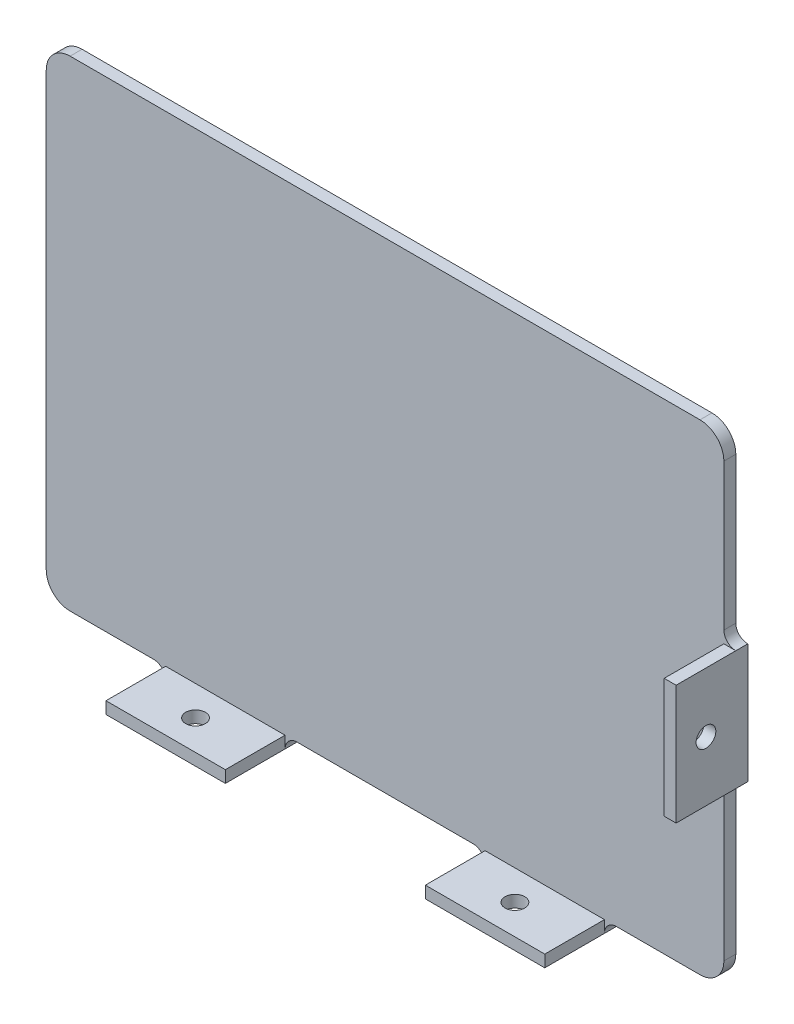
ISO-10303-21;
HEADER;
FILE_DESCRIPTION(('STEP AP214'),'2;1');
FILE_NAME('part.step','',(''),(''),'','','');
FILE_SCHEMA(('AUTOMOTIVE_DESIGN { 1 0 10303 214 1 1 1 1 }'));
ENDSEC;
DATA;
#1=APPLICATION_CONTEXT('core data for automotive mechanical design processes');
#2=APPLICATION_PROTOCOL_DEFINITION('international standard','automotive_design',2000,#1);
#3=PRODUCT_CONTEXT('',#1,'mechanical');
#4=PRODUCT('Part','Part','',(#3));
#5=PRODUCT_RELATED_PRODUCT_CATEGORY('part','',(#4));
#6=PRODUCT_DEFINITION_FORMATION('','',#4);
#7=PRODUCT_DEFINITION_CONTEXT('part definition',#1,'design');
#8=PRODUCT_DEFINITION('design','',#6,#7);
#9=PRODUCT_DEFINITION_SHAPE('','',#8);
#10=(LENGTH_UNIT() NAMED_UNIT(*) SI_UNIT(.MILLI.,.METRE.));
#11=(NAMED_UNIT(*) PLANE_ANGLE_UNIT() SI_UNIT($,.RADIAN.));
#12=(NAMED_UNIT(*) SI_UNIT($,.STERADIAN.) SOLID_ANGLE_UNIT());
#13=UNCERTAINTY_MEASURE_WITH_UNIT(LENGTH_MEASURE(1.E-05),#10,'distance_accuracy_value','');
#14=(GEOMETRIC_REPRESENTATION_CONTEXT(3) GLOBAL_UNCERTAINTY_ASSIGNED_CONTEXT((#13)) GLOBAL_UNIT_ASSIGNED_CONTEXT((#10,
#11,#12)) REPRESENTATION_CONTEXT('',''));
#15=CARTESIAN_POINT('',(0.,0.,0.));
#16=DIRECTION('',(0.,0.,1.));
#17=DIRECTION('',(1.,0.,0.));
#18=AXIS2_PLACEMENT_3D('',#15,#16,#17);
#19=CARTESIAN_POINT('',(4.00000000000003,0.,2.));
#20=DIRECTION('',(0.,1.,0.));
#21=DIRECTION('',(0.,0.,1.));
#22=AXIS2_PLACEMENT_3D('',#19,#20,#21);
#23=PLANE('',#22);
#24=DIRECTION('',(1.,0.,0.));
#25=VECTOR('',#24,1.);
#26=CARTESIAN_POINT('',(4.00000000000003,0.,2.));
#27=LINE('',#26,#25);
#28=CARTESIAN_POINT('',(42.,0.,2.));
#29=VERTEX_POINT('',#28);
#30=CARTESIAN_POINT('',(71.5,0.,2.));
#31=VERTEX_POINT('',#30);
#32=EDGE_CURVE('E378',#29,#31,#27,.T.);
#33=ORIENTED_EDGE('',*,*,#32,.F.);
#34=DIRECTION('',(0.,0.,1.));
#35=VECTOR('',#34,1.);
#36=CARTESIAN_POINT('',(42.,0.,2.));
#37=LINE('',#36,#35);
#38=CARTESIAN_POINT('',(42.,0.,0.));
#39=VERTEX_POINT('',#38);
#40=EDGE_CURVE('E479',#29,#39,#37,.F.);
#41=ORIENTED_EDGE('',*,*,#40,.T.);
#42=DIRECTION('',(1.,0.,0.));
#43=VECTOR('',#42,1.);
#44=CARTESIAN_POINT('',(4.00000000000003,0.,0.));
#45=LINE('',#44,#43);
#46=CARTESIAN_POINT('',(71.5,0.,0.));
#47=VERTEX_POINT('',#46);
#48=EDGE_CURVE('E408',#39,#47,#45,.T.);
#49=ORIENTED_EDGE('',*,*,#48,.T.);
#50=DIRECTION('',(0.,0.,1.));
#51=VECTOR('',#50,1.);
#52=CARTESIAN_POINT('',(71.5,0.,2.));
#53=LINE('',#52,#51);
#54=EDGE_CURVE('E475',#47,#31,#53,.T.);
#55=ORIENTED_EDGE('',*,*,#54,.T.);
#56=EDGE_LOOP('',(#33,#41,#49,#55));
#57=FACE_BOUND('',#56,.T.);
#58=ADVANCED_FACE('F39',(#57),#23,.F.);
#59=CARTESIAN_POINT('',(4.00000000000003,0.,0.));
#60=VERTEX_POINT('',#59);
#61=CARTESIAN_POINT('',(18.,0.,0.));
#62=VERTEX_POINT('',#61);
#63=EDGE_CURVE('E403',#60,#62,#45,.T.);
#64=ORIENTED_EDGE('',*,*,#63,.T.);
#65=DIRECTION('',(0.,0.,1.));
#66=VECTOR('',#65,1.);
#67=CARTESIAN_POINT('',(18.,0.,2.));
#68=LINE('',#67,#66);
#69=CARTESIAN_POINT('',(18.,0.,2.));
#70=VERTEX_POINT('',#69);
#71=EDGE_CURVE('E482',#62,#70,#68,.T.);
#72=ORIENTED_EDGE('',*,*,#71,.T.);
#73=CARTESIAN_POINT('',(4.00000000000003,0.,2.));
#74=VERTEX_POINT('',#73);
#75=EDGE_CURVE('E373',#74,#70,#27,.T.);
#76=ORIENTED_EDGE('',*,*,#75,.F.);
#77=DIRECTION('',(0.,0.,-1.));
#78=VECTOR('',#77,1.);
#79=CARTESIAN_POINT('',(4.00000000000003,0.,2.));
#80=LINE('',#79,#78);
#81=EDGE_CURVE('E454',#74,#60,#80,.T.);
#82=ORIENTED_EDGE('',*,*,#81,.T.);
#83=EDGE_LOOP('',(#64,#72,#76,#82));
#84=FACE_BOUND('',#83,.T.);
#85=ADVANCED_FACE('F611',(#84),#23,.F.);
#86=CARTESIAN_POINT('',(113.5,4.,2.));
#87=DIRECTION('',(-1.,0.,0.));
#88=DIRECTION('',(0.,0.,1.));
#89=AXIS2_PLACEMENT_3D('',#86,#87,#88);
#90=PLANE('',#89);
#91=DIRECTION('',(0.,1.,0.));
#92=VECTOR('',#91,1.);
#93=CARTESIAN_POINT('',(113.5,4.,2.));
#94=LINE('',#93,#92);
#95=CARTESIAN_POINT('',(113.5,52.,2.));
#96=VERTEX_POINT('',#95);
#97=CARTESIAN_POINT('',(113.5,76.5,2.));
#98=VERTEX_POINT('',#97);
#99=EDGE_CURVE('E381',#96,#98,#94,.T.);
#100=ORIENTED_EDGE('',*,*,#99,.F.);
#101=DIRECTION('',(0.,0.,1.));
#102=VECTOR('',#101,1.);
#103=CARTESIAN_POINT('',(113.5,52.,2.));
#104=LINE('',#103,#102);
#105=CARTESIAN_POINT('',(113.5,52.,0.));
#106=VERTEX_POINT('',#105);
#107=EDGE_CURVE('E461',#96,#106,#104,.F.);
#108=ORIENTED_EDGE('',*,*,#107,.T.);
#109=DIRECTION('',(0.,1.,0.));
#110=VECTOR('',#109,1.);
#111=CARTESIAN_POINT('',(113.5,4.,0.));
#112=LINE('',#111,#110);
#113=CARTESIAN_POINT('',(113.5,76.5,0.));
#114=VERTEX_POINT('',#113);
#115=EDGE_CURVE('E411',#106,#114,#112,.T.);
#116=ORIENTED_EDGE('',*,*,#115,.T.);
#117=DIRECTION('',(0.,0.,-1.));
#118=VECTOR('',#117,1.);
#119=CARTESIAN_POINT('',(113.5,76.5,2.));
#120=LINE('',#119,#118);
#121=EDGE_CURVE('E442',#98,#114,#120,.T.);
#122=ORIENTED_EDGE('',*,*,#121,.F.);
#123=EDGE_LOOP('',(#100,#108,#116,#122));
#124=FACE_BOUND('',#123,.T.);
#125=ADVANCED_FACE('F641',(#124),#90,.F.);
#126=CARTESIAN_POINT('',(4.,4.,2.));
#127=DIRECTION('',(0.,0.,-1.));
#128=DIRECTION('',(-1.,0.,0.));
#129=AXIS2_PLACEMENT_3D('',#126,#127,#128);
#130=CYLINDRICAL_SURFACE('',#129,4.);
#131=CARTESIAN_POINT('',(4.,4.,0.));
#132=DIRECTION('',(0.,0.,1.));
#133=DIRECTION('',(-1.,0.,0.));
#134=AXIS2_PLACEMENT_3D('',#131,#132,#133);
#135=CIRCLE('',#134,4.);
#136=CARTESIAN_POINT('',(0.,4.00000000000003,0.));
#137=VERTEX_POINT('',#136);
#138=EDGE_CURVE('E366',#137,#60,#135,.T.);
#139=ORIENTED_EDGE('',*,*,#138,.T.);
#140=ORIENTED_EDGE('',*,*,#81,.F.);
#141=CARTESIAN_POINT('',(4.,4.,2.));
#142=DIRECTION('',(0.,0.,1.));
#143=DIRECTION('',(-1.,0.,0.));
#144=AXIS2_PLACEMENT_3D('',#141,#142,#143);
#145=CIRCLE('',#144,4.);
#146=CARTESIAN_POINT('',(0.,4.00000000000003,2.));
#147=VERTEX_POINT('',#146);
#148=EDGE_CURVE('E367',#147,#74,#145,.T.);
#149=ORIENTED_EDGE('',*,*,#148,.F.);
#150=DIRECTION('',(0.,0.,-1.));
#151=VECTOR('',#150,1.);
#152=CARTESIAN_POINT('',(0.,4.00000000000003,2.));
#153=LINE('',#152,#151);
#154=EDGE_CURVE('E398',#147,#137,#153,.T.);
#155=ORIENTED_EDGE('',*,*,#154,.T.);
#156=EDGE_LOOP('',(#139,#140,#149,#155));
#157=FACE_BOUND('',#156,.T.);
#158=ADVANCED_FACE('F617',(#157),#130,.T.);
#159=CARTESIAN_POINT('',(95.5,0.,2.));
#160=VERTEX_POINT('',#159);
#161=CARTESIAN_POINT('',(109.5,0.,2.));
#162=VERTEX_POINT('',#161);
#163=EDGE_CURVE('E371',#160,#162,#27,.T.);
#164=ORIENTED_EDGE('',*,*,#163,.F.);
#165=DIRECTION('',(0.,0.,1.));
#166=VECTOR('',#165,1.);
#167=CARTESIAN_POINT('',(95.5,0.,2.));
#168=LINE('',#167,#166);
#169=CARTESIAN_POINT('',(95.5,0.,0.));
#170=VERTEX_POINT('',#169);
#171=EDGE_CURVE('E493',#160,#170,#168,.F.);
#172=ORIENTED_EDGE('',*,*,#171,.T.);
#173=CARTESIAN_POINT('',(109.5,0.,0.));
#174=VERTEX_POINT('',#173);
#175=EDGE_CURVE('E402',#170,#174,#45,.T.);
#176=ORIENTED_EDGE('',*,*,#175,.T.);
#177=DIRECTION('',(0.,0.,-1.));
#178=VECTOR('',#177,1.);
#179=CARTESIAN_POINT('',(109.5,0.,2.));
#180=LINE('',#179,#178);
#181=EDGE_CURVE('E450',#162,#174,#180,.T.);
#182=ORIENTED_EDGE('',*,*,#181,.F.);
#183=EDGE_LOOP('',(#164,#172,#176,#182));
#184=FACE_BOUND('',#183,.T.);
#185=ADVANCED_FACE('F534',(#184),#23,.F.);
#186=CARTESIAN_POINT('',(109.5,4.,2.));
#187=DIRECTION('',(0.,0.,-1.));
#188=DIRECTION('',(-1.,0.,0.));
#189=AXIS2_PLACEMENT_3D('',#186,#187,#188);
#190=CYLINDRICAL_SURFACE('',#189,4.);
#191=CARTESIAN_POINT('',(109.5,4.,0.));
#192=DIRECTION('',(0.,0.,1.));
#193=DIRECTION('',(1.,0.,0.));
#194=AXIS2_PLACEMENT_3D('',#191,#192,#193);
#195=CIRCLE('',#194,4.);
#196=CARTESIAN_POINT('',(113.5,4.,0.));
#197=VERTEX_POINT('',#196);
#198=EDGE_CURVE('E407',#174,#197,#195,.T.);
#199=ORIENTED_EDGE('',*,*,#198,.T.);
#200=DIRECTION('',(0.,0.,-1.));
#201=VECTOR('',#200,1.);
#202=CARTESIAN_POINT('',(113.5,4.,2.));
#203=LINE('',#202,#201);
#204=CARTESIAN_POINT('',(113.5,4.,2.));
#205=VERTEX_POINT('',#204);
#206=EDGE_CURVE('E446',#205,#197,#203,.T.);
#207=ORIENTED_EDGE('',*,*,#206,.F.);
#208=CARTESIAN_POINT('',(109.5,4.,2.));
#209=DIRECTION('',(0.,0.,1.));
#210=DIRECTION('',(1.,0.,0.));
#211=AXIS2_PLACEMENT_3D('',#208,#209,#210);
#212=CIRCLE('',#211,4.);
#213=EDGE_CURVE('E377',#162,#205,#212,.T.);
#214=ORIENTED_EDGE('',*,*,#213,.F.);
#215=ORIENTED_EDGE('',*,*,#181,.T.);
#216=EDGE_LOOP('',(#199,#207,#214,#215));
#217=FACE_BOUND('',#216,.T.);
#218=ADVANCED_FACE('F558',(#217),#190,.T.);
#219=CARTESIAN_POINT('',(113.5,28.,0.));
#220=VERTEX_POINT('',#219);
#221=EDGE_CURVE('E412',#197,#220,#112,.T.);
#222=ORIENTED_EDGE('',*,*,#221,.T.);
#223=DIRECTION('',(0.,0.,1.));
#224=VECTOR('',#223,1.);
#225=CARTESIAN_POINT('',(113.5,28.,2.));
#226=LINE('',#225,#224);
#227=CARTESIAN_POINT('',(113.5,28.,2.));
#228=VERTEX_POINT('',#227);
#229=EDGE_CURVE('E464',#220,#228,#226,.T.);
#230=ORIENTED_EDGE('',*,*,#229,.T.);
#231=EDGE_CURVE('E382',#205,#228,#94,.T.);
#232=ORIENTED_EDGE('',*,*,#231,.F.);
#233=ORIENTED_EDGE('',*,*,#206,.T.);
#234=EDGE_LOOP('',(#222,#230,#232,#233));
#235=FACE_BOUND('',#234,.T.);
#236=ADVANCED_FACE('F565',(#235),#90,.F.);
#237=CARTESIAN_POINT('',(109.5,76.5,2.));
#238=DIRECTION('',(0.,0.,-1.));
#239=DIRECTION('',(-1.,0.,0.));
#240=AXIS2_PLACEMENT_3D('',#237,#238,#239);
#241=CYLINDRICAL_SURFACE('',#240,4.);
#242=CARTESIAN_POINT('',(109.5,76.5,0.));
#243=DIRECTION('',(0.,0.,1.));
#244=DIRECTION('',(-1.,0.,0.));
#245=AXIS2_PLACEMENT_3D('',#242,#243,#244);
#246=CIRCLE('',#245,4.);
#247=CARTESIAN_POINT('',(109.5,80.5,0.));
#248=VERTEX_POINT('',#247);
#249=EDGE_CURVE('E416',#114,#248,#246,.T.);
#250=ORIENTED_EDGE('',*,*,#249,.T.);
#251=DIRECTION('',(0.,0.,-1.));
#252=VECTOR('',#251,1.);
#253=CARTESIAN_POINT('',(109.5,80.5,2.));
#254=LINE('',#253,#252);
#255=CARTESIAN_POINT('',(109.5,80.5,2.));
#256=VERTEX_POINT('',#255);
#257=EDGE_CURVE('E438',#256,#248,#254,.T.);
#258=ORIENTED_EDGE('',*,*,#257,.F.);
#259=CARTESIAN_POINT('',(109.5,76.5,2.));
#260=DIRECTION('',(0.,0.,1.));
#261=DIRECTION('',(-1.,0.,0.));
#262=AXIS2_PLACEMENT_3D('',#259,#260,#261);
#263=CIRCLE('',#262,4.);
#264=EDGE_CURVE('E386',#98,#256,#263,.T.);
#265=ORIENTED_EDGE('',*,*,#264,.F.);
#266=ORIENTED_EDGE('',*,*,#121,.T.);
#267=EDGE_LOOP('',(#250,#258,#265,#266));
#268=FACE_BOUND('',#267,.T.);
#269=ADVANCED_FACE('F636',(#268),#241,.T.);
#270=CARTESIAN_POINT('',(4.,80.5,2.));
#271=DIRECTION('',(0.,-1.,0.));
#272=DIRECTION('',(0.,0.,-1.));
#273=AXIS2_PLACEMENT_3D('',#270,#271,#272);
#274=PLANE('',#273);
#275=DIRECTION('',(-1.,0.,0.));
#276=VECTOR('',#275,1.);
#277=CARTESIAN_POINT('',(4.,80.5,0.));
#278=LINE('',#277,#276);
#279=CARTESIAN_POINT('',(4.,80.5,0.));
#280=VERTEX_POINT('',#279);
#281=EDGE_CURVE('E419',#248,#280,#278,.T.);
#282=ORIENTED_EDGE('',*,*,#281,.T.);
#283=DIRECTION('',(0.,0.,-1.));
#284=VECTOR('',#283,1.);
#285=CARTESIAN_POINT('',(4.,80.5,2.));
#286=LINE('',#285,#284);
#287=CARTESIAN_POINT('',(4.,80.5,2.));
#288=VERTEX_POINT('',#287);
#289=EDGE_CURVE('E434',#288,#280,#286,.T.);
#290=ORIENTED_EDGE('',*,*,#289,.F.);
#291=DIRECTION('',(-1.,0.,0.));
#292=VECTOR('',#291,1.);
#293=CARTESIAN_POINT('',(4.,80.5,2.));
#294=LINE('',#293,#292);
#295=EDGE_CURVE('E389',#256,#288,#294,.T.);
#296=ORIENTED_EDGE('',*,*,#295,.F.);
#297=ORIENTED_EDGE('',*,*,#257,.T.);
#298=EDGE_LOOP('',(#282,#290,#296,#297));
#299=FACE_BOUND('',#298,.T.);
#300=ADVANCED_FACE('F630',(#299),#274,.F.);
#301=CARTESIAN_POINT('',(4.,76.5,2.));
#302=DIRECTION('',(0.,0.,-1.));
#303=DIRECTION('',(-1.,0.,0.));
#304=AXIS2_PLACEMENT_3D('',#301,#302,#303);
#305=CYLINDRICAL_SURFACE('',#304,4.);
#306=CARTESIAN_POINT('',(4.,76.5,0.));
#307=DIRECTION('',(0.,0.,1.));
#308=DIRECTION('',(-1.,0.,0.));
#309=AXIS2_PLACEMENT_3D('',#306,#307,#308);
#310=CIRCLE('',#309,4.);
#311=CARTESIAN_POINT('',(0.,76.5,0.));
#312=VERTEX_POINT('',#311);
#313=EDGE_CURVE('E422',#280,#312,#310,.T.);
#314=ORIENTED_EDGE('',*,*,#313,.T.);
#315=DIRECTION('',(0.,0.,-1.));
#316=VECTOR('',#315,1.);
#317=CARTESIAN_POINT('',(0.,76.5,2.));
#318=LINE('',#317,#316);
#319=CARTESIAN_POINT('',(0.,76.5,2.));
#320=VERTEX_POINT('',#319);
#321=EDGE_CURVE('E430',#320,#312,#318,.T.);
#322=ORIENTED_EDGE('',*,*,#321,.F.);
#323=CARTESIAN_POINT('',(4.,76.5,2.));
#324=DIRECTION('',(0.,0.,1.));
#325=DIRECTION('',(-1.,0.,0.));
#326=AXIS2_PLACEMENT_3D('',#323,#324,#325);
#327=CIRCLE('',#326,4.);
#328=EDGE_CURVE('E392',#288,#320,#327,.T.);
#329=ORIENTED_EDGE('',*,*,#328,.F.);
#330=ORIENTED_EDGE('',*,*,#289,.T.);
#331=EDGE_LOOP('',(#314,#322,#329,#330));
#332=FACE_BOUND('',#331,.T.);
#333=ADVANCED_FACE('F626',(#332),#305,.T.);
#334=CARTESIAN_POINT('',(0.,4.00000000000003,2.));
#335=DIRECTION('',(1.,0.,0.));
#336=DIRECTION('',(0.,0.,-1.));
#337=AXIS2_PLACEMENT_3D('',#334,#335,#336);
#338=PLANE('',#337);
#339=DIRECTION('',(0.,-1.,0.));
#340=VECTOR('',#339,1.);
#341=CARTESIAN_POINT('',(0.,4.00000000000003,0.));
#342=LINE('',#341,#340);
#343=EDGE_CURVE('E372',#312,#137,#342,.T.);
#344=ORIENTED_EDGE('',*,*,#343,.T.);
#345=ORIENTED_EDGE('',*,*,#154,.F.);
#346=DIRECTION('',(0.,-1.,0.));
#347=VECTOR('',#346,1.);
#348=CARTESIAN_POINT('',(0.,4.00000000000003,2.));
#349=LINE('',#348,#347);
#350=EDGE_CURVE('E395',#320,#147,#349,.T.);
#351=ORIENTED_EDGE('',*,*,#350,.F.);
#352=ORIENTED_EDGE('',*,*,#321,.T.);
#353=EDGE_LOOP('',(#344,#345,#351,#352));
#354=FACE_BOUND('',#353,.T.);
#355=ADVANCED_FACE('F622',(#354),#338,.F.);
#356=CARTESIAN_POINT('',(4.,4.,2.));
#357=DIRECTION('',(0.,0.,-1.));
#358=DIRECTION('',(-1.,0.,0.));
#359=AXIS2_PLACEMENT_3D('',#356,#357,#358);
#360=PLANE('',#359);
#361=ORIENTED_EDGE('',*,*,#148,.T.);
#362=ORIENTED_EDGE('',*,*,#75,.T.);
#363=CARTESIAN_POINT('',(18.,-2.,2.));
#364=DIRECTION('',(0.,0.,-1.));
#365=DIRECTION('',(-1.,0.,0.));
#366=AXIS2_PLACEMENT_3D('',#363,#364,#365);
#367=CIRCLE('',#366,2.);
#368=CARTESIAN_POINT('',(20.,-2.00000000000004,2.));
#369=VERTEX_POINT('',#368);
#370=EDGE_CURVE('E514',#70,#369,#367,.T.);
#371=ORIENTED_EDGE('',*,*,#370,.T.);
#372=DIRECTION('',(0.,-1.,0.));
#373=VECTOR('',#372,1.);
#374=CARTESIAN_POINT('',(20.,0.,2.));
#375=LINE('',#374,#373);
#376=CARTESIAN_POINT('',(20.,0.,2.));
#377=VERTEX_POINT('',#376);
#378=EDGE_CURVE('E62',#377,#369,#375,.T.);
#379=ORIENTED_EDGE('',*,*,#378,.F.);
#380=DIRECTION('',(1.,0.,0.));
#381=VECTOR('',#380,1.);
#382=CARTESIAN_POINT('',(4.,0.,2.));
#383=LINE('',#382,#381);
#384=CARTESIAN_POINT('',(40.,0.,2.));
#385=VERTEX_POINT('',#384);
#386=EDGE_CURVE('E311',#377,#385,#383,.T.);
#387=ORIENTED_EDGE('',*,*,#386,.T.);
#388=DIRECTION('',(0.,1.,0.));
#389=VECTOR('',#388,1.);
#390=CARTESIAN_POINT('',(40.,0.,2.));
#391=LINE('',#390,#389);
#392=CARTESIAN_POINT('',(40.,-2.00000000000003,2.));
#393=VERTEX_POINT('',#392);
#394=EDGE_CURVE('E472',#393,#385,#391,.T.);
#395=ORIENTED_EDGE('',*,*,#394,.F.);
#396=CARTESIAN_POINT('',(42.,-2.,2.));
#397=DIRECTION('',(0.,0.,-1.));
#398=DIRECTION('',(-1.,0.,0.));
#399=AXIS2_PLACEMENT_3D('',#396,#397,#398);
#400=CIRCLE('',#399,2.);
#401=EDGE_CURVE('E508',#393,#29,#400,.T.);
#402=ORIENTED_EDGE('',*,*,#401,.T.);
#403=ORIENTED_EDGE('',*,*,#32,.T.);
#404=CARTESIAN_POINT('',(71.5,-2.,2.));
#405=DIRECTION('',(0.,0.,-1.));
#406=DIRECTION('',(-1.,0.,0.));
#407=AXIS2_PLACEMENT_3D('',#404,#405,#406);
#408=CIRCLE('',#407,2.);
#409=CARTESIAN_POINT('',(73.5,-2.00000000000001,2.));
#410=VERTEX_POINT('',#409);
#411=EDGE_CURVE('E520',#31,#410,#408,.T.);
#412=ORIENTED_EDGE('',*,*,#411,.T.);
#413=DIRECTION('',(0.,-1.,0.));
#414=VECTOR('',#413,1.);
#415=CARTESIAN_POINT('',(73.5,0.,2.));
#416=LINE('',#415,#414);
#417=CARTESIAN_POINT('',(73.5,0.,2.));
#418=VERTEX_POINT('',#417);
#419=EDGE_CURVE('E55',#418,#410,#416,.T.);
#420=ORIENTED_EDGE('',*,*,#419,.F.);
#421=DIRECTION('',(1.,0.,0.));
#422=VECTOR('',#421,1.);
#423=CARTESIAN_POINT('',(4.,0.,2.));
#424=LINE('',#423,#422);
#425=CARTESIAN_POINT('',(93.5,0.,2.));
#426=VERTEX_POINT('',#425);
#427=EDGE_CURVE('E277',#418,#426,#424,.T.);
#428=ORIENTED_EDGE('',*,*,#427,.T.);
#429=DIRECTION('',(0.,1.,0.));
#430=VECTOR('',#429,1.);
#431=CARTESIAN_POINT('',(93.5,0.,2.));
#432=LINE('',#431,#430);
#433=CARTESIAN_POINT('',(93.5,-2.,2.));
#434=VERTEX_POINT('',#433);
#435=EDGE_CURVE('E490',#434,#426,#432,.T.);
#436=ORIENTED_EDGE('',*,*,#435,.F.);
#437=CARTESIAN_POINT('',(95.5,-2.,2.));
#438=DIRECTION('',(0.,0.,-1.));
#439=DIRECTION('',(-1.,0.,0.));
#440=AXIS2_PLACEMENT_3D('',#437,#438,#439);
#441=CIRCLE('',#440,2.);
#442=EDGE_CURVE('E48',#434,#160,#441,.T.);
#443=ORIENTED_EDGE('',*,*,#442,.T.);
#444=ORIENTED_EDGE('',*,*,#163,.T.);
#445=ORIENTED_EDGE('',*,*,#213,.T.);
#446=ORIENTED_EDGE('',*,*,#231,.T.);
#447=CARTESIAN_POINT('',(115.5,28.,2.));
#448=DIRECTION('',(0.,0.,-1.));
#449=DIRECTION('',(-1.,0.,0.));
#450=AXIS2_PLACEMENT_3D('',#447,#448,#449);
#451=CIRCLE('',#450,2.);
#452=CARTESIAN_POINT('',(115.5,30.,2.));
#453=VERTEX_POINT('',#452);
#454=EDGE_CURVE('E502',#228,#453,#451,.T.);
#455=ORIENTED_EDGE('',*,*,#454,.T.);
#456=DIRECTION('',(1.,0.,0.));
#457=VECTOR('',#456,1.);
#458=CARTESIAN_POINT('',(113.5,30.,2.));
#459=LINE('',#458,#457);
#460=CARTESIAN_POINT('',(113.5,30.,2.));
#461=VERTEX_POINT('',#460);
#462=EDGE_CURVE('E468',#461,#453,#459,.T.);
#463=ORIENTED_EDGE('',*,*,#462,.F.);
#464=DIRECTION('',(0.,1.,0.));
#465=VECTOR('',#464,1.);
#466=CARTESIAN_POINT('',(113.5,4.,2.));
#467=LINE('',#466,#465);
#468=CARTESIAN_POINT('',(113.5,50.,2.));
#469=VERTEX_POINT('',#468);
#470=EDGE_CURVE('E350',#461,#469,#467,.T.);
#471=ORIENTED_EDGE('',*,*,#470,.T.);
#472=DIRECTION('',(-1.,0.,0.));
#473=VECTOR('',#472,1.);
#474=CARTESIAN_POINT('',(113.5,50.,2.));
#475=LINE('',#474,#473);
#476=CARTESIAN_POINT('',(115.5,50.,2.));
#477=VERTEX_POINT('',#476);
#478=EDGE_CURVE('E458',#477,#469,#475,.T.);
#479=ORIENTED_EDGE('',*,*,#478,.F.);
#480=CARTESIAN_POINT('',(115.5,52.,2.));
#481=DIRECTION('',(0.,0.,-1.));
#482=DIRECTION('',(-1.,0.,0.));
#483=AXIS2_PLACEMENT_3D('',#480,#481,#482);
#484=CIRCLE('',#483,2.);
#485=EDGE_CURVE('E496',#477,#96,#484,.T.);
#486=ORIENTED_EDGE('',*,*,#485,.T.);
#487=ORIENTED_EDGE('',*,*,#99,.T.);
#488=ORIENTED_EDGE('',*,*,#264,.T.);
#489=ORIENTED_EDGE('',*,*,#295,.T.);
#490=ORIENTED_EDGE('',*,*,#328,.T.);
#491=ORIENTED_EDGE('',*,*,#350,.T.);
#492=EDGE_LOOP('',(#361,#362,#371,#379,#387,#395,#402,#403,#412,#420,#428,#436,#443,#444,#445,
#446,#455,#463,#471,#479,#486,#487,#488,#489,#490,#491));
#493=FACE_BOUND('',#492,.T.);
#494=ADVANCED_FACE('F528',(#493),#360,.F.);
#495=CARTESIAN_POINT('',(4.,4.,0.));
#496=DIRECTION('',(0.,0.,-1.));
#497=DIRECTION('',(-1.,0.,0.));
#498=AXIS2_PLACEMENT_3D('',#495,#496,#497);
#499=PLANE('',#498);
#500=ORIENTED_EDGE('',*,*,#138,.F.);
#501=ORIENTED_EDGE('',*,*,#343,.F.);
#502=ORIENTED_EDGE('',*,*,#313,.F.);
#503=ORIENTED_EDGE('',*,*,#281,.F.);
#504=ORIENTED_EDGE('',*,*,#249,.F.);
#505=ORIENTED_EDGE('',*,*,#115,.F.);
#506=CARTESIAN_POINT('',(115.5,52.,0.));
#507=DIRECTION('',(0.,0.,-1.));
#508=DIRECTION('',(-1.,0.,0.));
#509=AXIS2_PLACEMENT_3D('',#506,#507,#508);
#510=CIRCLE('',#509,2.);
#511=CARTESIAN_POINT('',(115.5,50.,0.));
#512=VERTEX_POINT('',#511);
#513=EDGE_CURVE('E499',#106,#512,#510,.F.);
#514=ORIENTED_EDGE('',*,*,#513,.T.);
#515=DIRECTION('',(0.,1.,0.));
#516=VECTOR('',#515,1.);
#517=CARTESIAN_POINT('',(115.5,50.,0.));
#518=LINE('',#517,#516);
#519=CARTESIAN_POINT('',(115.5,30.,0.));
#520=VERTEX_POINT('',#519);
#521=EDGE_CURVE('E342',#520,#512,#518,.T.);
#522=ORIENTED_EDGE('',*,*,#521,.F.);
#523=CARTESIAN_POINT('',(115.5,28.,0.));
#524=DIRECTION('',(0.,0.,-1.));
#525=DIRECTION('',(-1.,0.,0.));
#526=AXIS2_PLACEMENT_3D('',#523,#524,#525);
#527=CIRCLE('',#526,2.);
#528=EDGE_CURVE('E505',#520,#220,#527,.F.);
#529=ORIENTED_EDGE('',*,*,#528,.T.);
#530=ORIENTED_EDGE('',*,*,#221,.F.);
#531=ORIENTED_EDGE('',*,*,#198,.F.);
#532=ORIENTED_EDGE('',*,*,#175,.F.);
#533=CARTESIAN_POINT('',(95.5,-2.,0.));
#534=DIRECTION('',(0.,0.,-1.));
#535=DIRECTION('',(-1.,0.,0.));
#536=AXIS2_PLACEMENT_3D('',#533,#534,#535);
#537=CIRCLE('',#536,2.);
#538=CARTESIAN_POINT('',(93.5,-2.,0.));
#539=VERTEX_POINT('',#538);
#540=EDGE_CURVE('E11',#170,#539,#537,.F.);
#541=ORIENTED_EDGE('',*,*,#540,.T.);
#542=DIRECTION('',(1.,0.,0.));
#543=VECTOR('',#542,1.);
#544=CARTESIAN_POINT('',(73.5,-2.00000000000001,0.));
#545=LINE('',#544,#543);
#546=CARTESIAN_POINT('',(73.5,-2.00000000000001,0.));
#547=VERTEX_POINT('',#546);
#548=EDGE_CURVE('E240',#547,#539,#545,.T.);
#549=ORIENTED_EDGE('',*,*,#548,.F.);
#550=CARTESIAN_POINT('',(71.5,-2.,0.));
#551=DIRECTION('',(0.,0.,-1.));
#552=DIRECTION('',(-1.,0.,0.));
#553=AXIS2_PLACEMENT_3D('',#550,#551,#552);
#554=CIRCLE('',#553,2.);
#555=EDGE_CURVE('E523',#547,#47,#554,.F.);
#556=ORIENTED_EDGE('',*,*,#555,.T.);
#557=ORIENTED_EDGE('',*,*,#48,.F.);
#558=CARTESIAN_POINT('',(42.,-2.,0.));
#559=DIRECTION('',(0.,0.,-1.));
#560=DIRECTION('',(-1.,0.,0.));
#561=AXIS2_PLACEMENT_3D('',#558,#559,#560);
#562=CIRCLE('',#561,2.);
#563=CARTESIAN_POINT('',(40.,-2.00000000000003,0.));
#564=VERTEX_POINT('',#563);
#565=EDGE_CURVE('E511',#39,#564,#562,.F.);
#566=ORIENTED_EDGE('',*,*,#565,.T.);
#567=DIRECTION('',(1.,0.,0.));
#568=VECTOR('',#567,1.);
#569=CARTESIAN_POINT('',(20.,-2.00000000000004,0.));
#570=LINE('',#569,#568);
#571=CARTESIAN_POINT('',(20.,-2.00000000000004,0.));
#572=VERTEX_POINT('',#571);
#573=EDGE_CURVE('E303',#572,#564,#570,.T.);
#574=ORIENTED_EDGE('',*,*,#573,.F.);
#575=CARTESIAN_POINT('',(18.,-2.,0.));
#576=DIRECTION('',(0.,0.,-1.));
#577=DIRECTION('',(-1.,0.,0.));
#578=AXIS2_PLACEMENT_3D('',#575,#576,#577);
#579=CIRCLE('',#578,2.);
#580=EDGE_CURVE('E517',#572,#62,#579,.F.);
#581=ORIENTED_EDGE('',*,*,#580,.T.);
#582=ORIENTED_EDGE('',*,*,#63,.F.);
#583=EDGE_LOOP('',(#500,#501,#502,#503,#504,#505,#514,#522,#529,#530,#531,#532,#541,#549,#556,
#557,#566,#574,#581,#582));
#584=FACE_BOUND('',#583,.T.);
#585=ADVANCED_FACE('F542',(#584),#499,.T.);
#586=CARTESIAN_POINT('',(113.5,50.,0.));
#587=DIRECTION('',(-1.,0.,0.));
#588=DIRECTION('',(0.,0.,1.));
#589=AXIS2_PLACEMENT_3D('',#586,#587,#588);
#590=PLANE('',#589);
#591=CARTESIAN_POINT('',(113.5,40.,7.));
#592=DIRECTION('',(-1.,0.,0.));
#593=DIRECTION('',(0.,0.,1.));
#594=AXIS2_PLACEMENT_3D('',#591,#592,#593);
#595=CIRCLE('',#594,1.65);
#596=CARTESIAN_POINT('',(113.5,40.,8.65));
#597=VERTEX_POINT('',#596);
#598=EDGE_CURVE('E259',#597,#597,#595,.T.);
#599=ORIENTED_EDGE('',*,*,#598,.F.);
#600=EDGE_LOOP('',(#599));
#601=FACE_BOUND('',#600,.T.);
#602=ORIENTED_EDGE('',*,*,#470,.F.);
#603=DIRECTION('',(0.,0.,1.));
#604=VECTOR('',#603,1.);
#605=CARTESIAN_POINT('',(113.5,30.,0.));
#606=LINE('',#605,#604);
#607=CARTESIAN_POINT('',(113.5,30.,12.));
#608=VERTEX_POINT('',#607);
#609=EDGE_CURVE('E346',#461,#608,#606,.T.);
#610=ORIENTED_EDGE('',*,*,#609,.T.);
#611=DIRECTION('',(0.,-1.,0.));
#612=VECTOR('',#611,1.);
#613=CARTESIAN_POINT('',(113.5,50.,12.));
#614=LINE('',#613,#612);
#615=CARTESIAN_POINT('',(113.5,50.,12.));
#616=VERTEX_POINT('',#615);
#617=EDGE_CURVE('E326',#616,#608,#614,.T.);
#618=ORIENTED_EDGE('',*,*,#617,.F.);
#619=DIRECTION('',(0.,0.,1.));
#620=VECTOR('',#619,1.);
#621=CARTESIAN_POINT('',(113.5,50.,0.));
#622=LINE('',#621,#620);
#623=EDGE_CURVE('E347',#469,#616,#622,.T.);
#624=ORIENTED_EDGE('',*,*,#623,.F.);
#625=EDGE_LOOP('',(#602,#610,#618,#624));
#626=FACE_BOUND('',#625,.T.);
#627=ADVANCED_FACE('F659',(#601,#626),#590,.T.);
#628=CARTESIAN_POINT('',(113.5,50.,0.));
#629=DIRECTION('',(0.,1.,0.));
#630=DIRECTION('',(0.,0.,1.));
#631=AXIS2_PLACEMENT_3D('',#628,#629,#630);
#632=PLANE('',#631);
#633=DIRECTION('',(0.,0.,1.));
#634=VECTOR('',#633,1.);
#635=CARTESIAN_POINT('',(115.5,50.,0.));
#636=LINE('',#635,#634);
#637=CARTESIAN_POINT('',(115.5,50.,12.));
#638=VERTEX_POINT('',#637);
#639=EDGE_CURVE('E355',#477,#638,#636,.T.);
#640=ORIENTED_EDGE('',*,*,#639,.F.);
#641=ORIENTED_EDGE('',*,*,#478,.T.);
#642=ORIENTED_EDGE('',*,*,#623,.T.);
#643=DIRECTION('',(-1.,0.,0.));
#644=VECTOR('',#643,1.);
#645=CARTESIAN_POINT('',(113.5,50.,12.));
#646=LINE('',#645,#644);
#647=EDGE_CURVE('E338',#638,#616,#646,.T.);
#648=ORIENTED_EDGE('',*,*,#647,.F.);
#649=EDGE_LOOP('',(#640,#641,#642,#648));
#650=FACE_BOUND('',#649,.T.);
#651=ADVANCED_FACE('F656',(#650),#632,.T.);
#652=CARTESIAN_POINT('',(115.5,50.,0.));
#653=DIRECTION('',(1.,0.,0.));
#654=DIRECTION('',(0.,0.,-1.));
#655=AXIS2_PLACEMENT_3D('',#652,#653,#654);
#656=PLANE('',#655);
#657=CARTESIAN_POINT('',(115.5,40.,7.));
#658=DIRECTION('',(1.,0.,0.));
#659=DIRECTION('',(0.,0.,-1.));
#660=AXIS2_PLACEMENT_3D('',#657,#658,#659);
#661=CIRCLE('',#660,1.65);
#662=CARTESIAN_POINT('',(115.5,40.,5.35));
#663=VERTEX_POINT('',#662);
#664=EDGE_CURVE('E263',#663,#663,#661,.T.);
#665=ORIENTED_EDGE('',*,*,#664,.F.);
#666=EDGE_LOOP('',(#665));
#667=FACE_BOUND('',#666,.T.);
#668=EDGE_CURVE('E351',#512,#477,#636,.T.);
#669=ORIENTED_EDGE('',*,*,#668,.T.);
#670=ORIENTED_EDGE('',*,*,#639,.T.);
#671=DIRECTION('',(0.,1.,0.));
#672=VECTOR('',#671,1.);
#673=CARTESIAN_POINT('',(115.5,50.,12.));
#674=LINE('',#673,#672);
#675=CARTESIAN_POINT('',(115.5,30.,12.));
#676=VERTEX_POINT('',#675);
#677=EDGE_CURVE('E334',#676,#638,#674,.T.);
#678=ORIENTED_EDGE('',*,*,#677,.F.);
#679=DIRECTION('',(0.,0.,1.));
#680=VECTOR('',#679,1.);
#681=CARTESIAN_POINT('',(115.5,30.,0.));
#682=LINE('',#681,#680);
#683=EDGE_CURVE('E360',#453,#676,#682,.T.);
#684=ORIENTED_EDGE('',*,*,#683,.F.);
#685=EDGE_CURVE('E356',#520,#453,#682,.T.);
#686=ORIENTED_EDGE('',*,*,#685,.F.);
#687=ORIENTED_EDGE('',*,*,#521,.T.);
#688=EDGE_LOOP('',(#669,#670,#678,#684,#686,#687));
#689=FACE_BOUND('',#688,.T.);
#690=ADVANCED_FACE('F577',(#667,#689),#656,.T.);
#691=CARTESIAN_POINT('',(113.5,30.,0.));
#692=DIRECTION('',(0.,-1.,0.));
#693=DIRECTION('',(0.,0.,-1.));
#694=AXIS2_PLACEMENT_3D('',#691,#692,#693);
#695=PLANE('',#694);
#696=ORIENTED_EDGE('',*,*,#609,.F.);
#697=ORIENTED_EDGE('',*,*,#462,.T.);
#698=ORIENTED_EDGE('',*,*,#683,.T.);
#699=DIRECTION('',(1.,0.,0.));
#700=VECTOR('',#699,1.);
#701=CARTESIAN_POINT('',(113.5,30.,12.));
#702=LINE('',#701,#700);
#703=EDGE_CURVE('E330',#608,#676,#702,.T.);
#704=ORIENTED_EDGE('',*,*,#703,.F.);
#705=EDGE_LOOP('',(#696,#697,#698,#704));
#706=FACE_BOUND('',#705,.T.);
#707=ADVANCED_FACE('F572',(#706),#695,.T.);
#708=CARTESIAN_POINT('',(0.,0.,12.));
#709=DIRECTION('',(0.,0.,1.));
#710=DIRECTION('',(1.,0.,0.));
#711=AXIS2_PLACEMENT_3D('',#708,#709,#710);
#712=PLANE('',#711);
#713=ORIENTED_EDGE('',*,*,#617,.T.);
#714=ORIENTED_EDGE('',*,*,#703,.T.);
#715=ORIENTED_EDGE('',*,*,#677,.T.);
#716=ORIENTED_EDGE('',*,*,#647,.T.);
#717=EDGE_LOOP('',(#713,#714,#715,#716));
#718=FACE_BOUND('',#717,.T.);
#719=ADVANCED_FACE('F654',(#718),#712,.T.);
#720=CARTESIAN_POINT('',(20.,0.,0.));
#721=DIRECTION('',(0.,1.,0.));
#722=DIRECTION('',(0.,0.,1.));
#723=AXIS2_PLACEMENT_3D('',#720,#721,#722);
#724=PLANE('',#723);
#725=CARTESIAN_POINT('',(30.,0.,7.));
#726=DIRECTION('',(0.,1.,0.));
#727=DIRECTION('',(0.,0.,1.));
#728=AXIS2_PLACEMENT_3D('',#725,#726,#727);
#729=CIRCLE('',#728,1.65);
#730=CARTESIAN_POINT('',(30.,0.,8.65));
#731=VERTEX_POINT('',#730);
#732=EDGE_CURVE('E974',#731,#731,#729,.T.);
#733=ORIENTED_EDGE('',*,*,#732,.F.);
#734=EDGE_LOOP('',(#733));
#735=FACE_BOUND('',#734,.T.);
#736=ORIENTED_EDGE('',*,*,#386,.F.);
#737=DIRECTION('',(0.,0.,1.));
#738=VECTOR('',#737,1.);
#739=CARTESIAN_POINT('',(20.,0.,0.));
#740=LINE('',#739,#738);
#741=CARTESIAN_POINT('',(20.,0.,12.));
#742=VERTEX_POINT('',#741);
#743=EDGE_CURVE('E308',#377,#742,#740,.T.);
#744=ORIENTED_EDGE('',*,*,#743,.T.);
#745=DIRECTION('',(-1.,0.,0.));
#746=VECTOR('',#745,1.);
#747=CARTESIAN_POINT('',(20.,0.,12.));
#748=LINE('',#747,#746);
#749=CARTESIAN_POINT('',(40.,0.,12.));
#750=VERTEX_POINT('',#749);
#751=EDGE_CURVE('E299',#750,#742,#748,.T.);
#752=ORIENTED_EDGE('',*,*,#751,.F.);
#753=DIRECTION('',(0.,0.,1.));
#754=VECTOR('',#753,1.);
#755=CARTESIAN_POINT('',(40.,0.,0.));
#756=LINE('',#755,#754);
#757=EDGE_CURVE('E312',#385,#750,#756,.T.);
#758=ORIENTED_EDGE('',*,*,#757,.F.);
#759=EDGE_LOOP('',(#736,#744,#752,#758));
#760=FACE_BOUND('',#759,.T.);
#761=ADVANCED_FACE('F598',(#735,#760),#724,.T.);
#762=CARTESIAN_POINT('',(20.,0.,0.));
#763=DIRECTION('',(-1.,0.,0.));
#764=DIRECTION('',(0.,0.,1.));
#765=AXIS2_PLACEMENT_3D('',#762,#763,#764);
#766=PLANE('',#765);
#767=ORIENTED_EDGE('',*,*,#743,.F.);
#768=ORIENTED_EDGE('',*,*,#378,.T.);
#769=DIRECTION('',(0.,0.,1.));
#770=VECTOR('',#769,1.);
#771=CARTESIAN_POINT('',(20.,-2.00000000000004,0.));
#772=LINE('',#771,#770);
#773=CARTESIAN_POINT('',(20.,-2.00000000000004,12.));
#774=VERTEX_POINT('',#773);
#775=EDGE_CURVE('E307',#369,#774,#772,.T.);
#776=ORIENTED_EDGE('',*,*,#775,.T.);
#777=DIRECTION('',(0.,-1.,0.));
#778=VECTOR('',#777,1.);
#779=CARTESIAN_POINT('',(20.,0.,12.));
#780=LINE('',#779,#778);
#781=EDGE_CURVE('E287',#742,#774,#780,.T.);
#782=ORIENTED_EDGE('',*,*,#781,.F.);
#783=EDGE_LOOP('',(#767,#768,#776,#782));
#784=FACE_BOUND('',#783,.T.);
#785=ADVANCED_FACE('F587',(#784),#766,.T.);
#786=CARTESIAN_POINT('',(40.,0.,0.));
#787=DIRECTION('',(1.,0.,0.));
#788=DIRECTION('',(0.,0.,-1.));
#789=AXIS2_PLACEMENT_3D('',#786,#787,#788);
#790=PLANE('',#789);
#791=DIRECTION('',(0.,0.,1.));
#792=VECTOR('',#791,1.);
#793=CARTESIAN_POINT('',(40.,-2.00000000000003,0.));
#794=LINE('',#793,#792);
#795=CARTESIAN_POINT('',(40.,-2.00000000000003,12.));
#796=VERTEX_POINT('',#795);
#797=EDGE_CURVE('E319',#393,#796,#794,.T.);
#798=ORIENTED_EDGE('',*,*,#797,.F.);
#799=ORIENTED_EDGE('',*,*,#394,.T.);
#800=ORIENTED_EDGE('',*,*,#757,.T.);
#801=DIRECTION('',(0.,1.,0.));
#802=VECTOR('',#801,1.);
#803=CARTESIAN_POINT('',(40.,0.,12.));
#804=LINE('',#803,#802);
#805=EDGE_CURVE('E295',#796,#750,#804,.T.);
#806=ORIENTED_EDGE('',*,*,#805,.F.);
#807=EDGE_LOOP('',(#798,#799,#800,#806));
#808=FACE_BOUND('',#807,.T.);
#809=ADVANCED_FACE('F601',(#808),#790,.T.);
#810=CARTESIAN_POINT('',(20.,-2.00000000000004,0.));
#811=DIRECTION('',(0.,-1.,0.));
#812=DIRECTION('',(1.,0.,0.));
#813=AXIS2_PLACEMENT_3D('',#810,#811,#812);
#814=PLANE('',#813);
#815=CARTESIAN_POINT('',(30.,-2.00000000000004,7.));
#816=DIRECTION('',(0.,-1.,0.));
#817=DIRECTION('',(1.,0.,0.));
#818=AXIS2_PLACEMENT_3D('',#815,#816,#817);
#819=CIRCLE('',#818,1.65);
#820=CARTESIAN_POINT('',(31.65,-2.00000000000004,7.));
#821=VERTEX_POINT('',#820);
#822=EDGE_CURVE('E984',#821,#821,#819,.T.);
#823=ORIENTED_EDGE('',*,*,#822,.F.);
#824=EDGE_LOOP('',(#823));
#825=FACE_BOUND('',#824,.T.);
#826=EDGE_CURVE('E315',#564,#393,#794,.T.);
#827=ORIENTED_EDGE('',*,*,#826,.T.);
#828=ORIENTED_EDGE('',*,*,#797,.T.);
#829=DIRECTION('',(1.,0.,0.));
#830=VECTOR('',#829,1.);
#831=CARTESIAN_POINT('',(20.,-2.00000000000004,12.));
#832=LINE('',#831,#830);
#833=EDGE_CURVE('E291',#774,#796,#832,.T.);
#834=ORIENTED_EDGE('',*,*,#833,.F.);
#835=ORIENTED_EDGE('',*,*,#775,.F.);
#836=EDGE_CURVE('E320',#572,#369,#772,.T.);
#837=ORIENTED_EDGE('',*,*,#836,.F.);
#838=ORIENTED_EDGE('',*,*,#573,.T.);
#839=EDGE_LOOP('',(#827,#828,#834,#835,#837,#838));
#840=FACE_BOUND('',#839,.T.);
#841=ADVANCED_FACE('F589',(#825,#840),#814,.T.);
#842=CARTESIAN_POINT('',(0.,0.,12.));
#843=DIRECTION('',(0.,0.,1.));
#844=DIRECTION('',(1.,0.,0.));
#845=AXIS2_PLACEMENT_3D('',#842,#843,#844);
#846=PLANE('',#845);
#847=ORIENTED_EDGE('',*,*,#781,.T.);
#848=ORIENTED_EDGE('',*,*,#833,.T.);
#849=ORIENTED_EDGE('',*,*,#805,.T.);
#850=ORIENTED_EDGE('',*,*,#751,.T.);
#851=EDGE_LOOP('',(#847,#848,#849,#850));
#852=FACE_BOUND('',#851,.T.);
#853=ADVANCED_FACE('F593',(#852),#846,.T.);
#854=CARTESIAN_POINT('',(73.5,0.,0.));
#855=DIRECTION('',(0.,1.,0.));
#856=DIRECTION('',(0.,0.,1.));
#857=AXIS2_PLACEMENT_3D('',#854,#855,#856);
#858=PLANE('',#857);
#859=CARTESIAN_POINT('',(83.5,0.,7.));
#860=DIRECTION('',(0.,1.,0.));
#861=DIRECTION('',(0.,0.,1.));
#862=AXIS2_PLACEMENT_3D('',#859,#860,#861);
#863=CIRCLE('',#862,1.65);
#864=CARTESIAN_POINT('',(83.5,0.,8.65));
#865=VERTEX_POINT('',#864);
#866=EDGE_CURVE('E977',#865,#865,#863,.T.);
#867=ORIENTED_EDGE('',*,*,#866,.F.);
#868=EDGE_LOOP('',(#867));
#869=FACE_BOUND('',#868,.T.);
#870=ORIENTED_EDGE('',*,*,#427,.F.);
#871=DIRECTION('',(0.,0.,1.));
#872=VECTOR('',#871,1.);
#873=CARTESIAN_POINT('',(73.5,0.,0.));
#874=LINE('',#873,#872);
#875=CARTESIAN_POINT('',(73.5,0.,12.));
#876=VERTEX_POINT('',#875);
#877=EDGE_CURVE('E274',#418,#876,#874,.T.);
#878=ORIENTED_EDGE('',*,*,#877,.T.);
#879=DIRECTION('',(-1.,0.,0.));
#880=VECTOR('',#879,1.);
#881=CARTESIAN_POINT('',(73.5,0.,12.));
#882=LINE('',#881,#880);
#883=CARTESIAN_POINT('',(93.5,0.,12.));
#884=VERTEX_POINT('',#883);
#885=EDGE_CURVE('E257',#884,#876,#882,.T.);
#886=ORIENTED_EDGE('',*,*,#885,.F.);
#887=DIRECTION('',(0.,0.,1.));
#888=VECTOR('',#887,1.);
#889=CARTESIAN_POINT('',(93.5,0.,0.));
#890=LINE('',#889,#888);
#891=EDGE_CURVE('E278',#426,#884,#890,.T.);
#892=ORIENTED_EDGE('',*,*,#891,.F.);
#893=EDGE_LOOP('',(#870,#878,#886,#892));
#894=FACE_BOUND('',#893,.T.);
#895=ADVANCED_FACE('F763',(#869,#894),#858,.T.);
#896=CARTESIAN_POINT('',(73.5,0.,0.));
#897=DIRECTION('',(-1.,0.,0.));
#898=DIRECTION('',(0.,0.,1.));
#899=AXIS2_PLACEMENT_3D('',#896,#897,#898);
#900=PLANE('',#899);
#901=ORIENTED_EDGE('',*,*,#877,.F.);
#902=ORIENTED_EDGE('',*,*,#419,.T.);
#903=DIRECTION('',(0.,0.,1.));
#904=VECTOR('',#903,1.);
#905=CARTESIAN_POINT('',(73.5,-2.00000000000001,0.));
#906=LINE('',#905,#904);
#907=CARTESIAN_POINT('',(73.5,-2.00000000000001,12.));
#908=VERTEX_POINT('',#907);
#909=EDGE_CURVE('E231',#410,#908,#906,.T.);
#910=ORIENTED_EDGE('',*,*,#909,.T.);
#911=DIRECTION('',(0.,-1.,0.));
#912=VECTOR('',#911,1.);
#913=CARTESIAN_POINT('',(73.5,0.,12.));
#914=LINE('',#913,#912);
#915=EDGE_CURVE('E235',#876,#908,#914,.T.);
#916=ORIENTED_EDGE('',*,*,#915,.F.);
#917=EDGE_LOOP('',(#901,#902,#910,#916));
#918=FACE_BOUND('',#917,.T.);
#919=ADVANCED_FACE('F233',(#918),#900,.T.);
#920=CARTESIAN_POINT('',(93.5,0.,0.));
#921=DIRECTION('',(1.,0.,0.));
#922=DIRECTION('',(0.,0.,-1.));
#923=AXIS2_PLACEMENT_3D('',#920,#921,#922);
#924=PLANE('',#923);
#925=DIRECTION('',(0.,0.,1.));
#926=VECTOR('',#925,1.);
#927=CARTESIAN_POINT('',(93.5,-2.,0.));
#928=LINE('',#927,#926);
#929=CARTESIAN_POINT('',(93.5,-2.,12.));
#930=VERTEX_POINT('',#929);
#931=EDGE_CURVE('E247',#434,#930,#928,.T.);
#932=ORIENTED_EDGE('',*,*,#931,.F.);
#933=ORIENTED_EDGE('',*,*,#435,.T.);
#934=ORIENTED_EDGE('',*,*,#891,.T.);
#935=DIRECTION('',(0.,1.,0.));
#936=VECTOR('',#935,1.);
#937=CARTESIAN_POINT('',(93.5,0.,12.));
#938=LINE('',#937,#936);
#939=EDGE_CURVE('E252',#930,#884,#938,.T.);
#940=ORIENTED_EDGE('',*,*,#939,.F.);
#941=EDGE_LOOP('',(#932,#933,#934,#940));
#942=FACE_BOUND('',#941,.T.);
#943=ADVANCED_FACE('F742',(#942),#924,.T.);
#944=CARTESIAN_POINT('',(73.5,-2.00000000000001,0.));
#945=DIRECTION('',(0.,-1.,0.));
#946=DIRECTION('',(1.,0.,0.));
#947=AXIS2_PLACEMENT_3D('',#944,#945,#946);
#948=PLANE('',#947);
#949=CARTESIAN_POINT('',(83.5,-2.00000000000002,7.));
#950=DIRECTION('',(0.,-1.,0.));
#951=DIRECTION('',(1.,0.,0.));
#952=AXIS2_PLACEMENT_3D('',#949,#950,#951);
#953=CIRCLE('',#952,1.65);
#954=CARTESIAN_POINT('',(85.15,-2.00000000000002,7.));
#955=VERTEX_POINT('',#954);
#956=EDGE_CURVE('E983',#955,#955,#953,.T.);
#957=ORIENTED_EDGE('',*,*,#956,.F.);
#958=EDGE_LOOP('',(#957));
#959=FACE_BOUND('',#958,.T.);
#960=EDGE_CURVE('E281',#539,#434,#928,.T.);
#961=ORIENTED_EDGE('',*,*,#960,.T.);
#962=ORIENTED_EDGE('',*,*,#931,.T.);
#963=DIRECTION('',(1.,0.,0.));
#964=VECTOR('',#963,1.);
#965=CARTESIAN_POINT('',(73.5,-2.00000000000001,12.));
#966=LINE('',#965,#964);
#967=EDGE_CURVE('E243',#908,#930,#966,.T.);
#968=ORIENTED_EDGE('',*,*,#967,.F.);
#969=ORIENTED_EDGE('',*,*,#909,.F.);
#970=EDGE_CURVE('E239',#547,#410,#906,.T.);
#971=ORIENTED_EDGE('',*,*,#970,.F.);
#972=ORIENTED_EDGE('',*,*,#548,.T.);
#973=EDGE_LOOP('',(#961,#962,#968,#969,#971,#972));
#974=FACE_BOUND('',#973,.T.);
#975=ADVANCED_FACE('F245',(#959,#974),#948,.T.);
#976=CARTESIAN_POINT('',(0.,0.,12.));
#977=DIRECTION('',(0.,0.,1.));
#978=DIRECTION('',(1.,0.,0.));
#979=AXIS2_PLACEMENT_3D('',#976,#977,#978);
#980=PLANE('',#979);
#981=ORIENTED_EDGE('',*,*,#915,.T.);
#982=ORIENTED_EDGE('',*,*,#967,.T.);
#983=ORIENTED_EDGE('',*,*,#939,.T.);
#984=ORIENTED_EDGE('',*,*,#885,.T.);
#985=EDGE_LOOP('',(#981,#982,#983,#984));
#986=FACE_BOUND('',#985,.T.);
#987=ADVANCED_FACE('F255',(#986),#980,.T.);
#988=CARTESIAN_POINT('',(103.5,40.,7.));
#989=DIRECTION('',(1.,0.,0.));
#990=DIRECTION('',(0.,0.,-1.));
#991=AXIS2_PLACEMENT_3D('',#988,#989,#990);
#992=CYLINDRICAL_SURFACE('',#991,1.65);
#993=ORIENTED_EDGE('',*,*,#598,.T.);
#994=EDGE_LOOP('',(#993));
#995=FACE_BOUND('',#994,.T.);
#996=ORIENTED_EDGE('',*,*,#664,.T.);
#997=EDGE_LOOP('',(#996));
#998=FACE_BOUND('',#997,.T.);
#999=ADVANCED_FACE('F885',(#995,#998),#992,.F.);
#1000=CARTESIAN_POINT('',(83.5,9.99999999999998,7.));
#1001=DIRECTION('',(0.,-1.,0.));
#1002=DIRECTION('',(1.,0.,0.));
#1003=AXIS2_PLACEMENT_3D('',#1000,#1001,#1002);
#1004=CYLINDRICAL_SURFACE('',#1003,1.65);
#1005=ORIENTED_EDGE('',*,*,#866,.T.);
#1006=EDGE_LOOP('',(#1005));
#1007=FACE_BOUND('',#1006,.T.);
#1008=ORIENTED_EDGE('',*,*,#956,.T.);
#1009=EDGE_LOOP('',(#1008));
#1010=FACE_BOUND('',#1009,.T.);
#1011=ADVANCED_FACE('F875',(#1007,#1010),#1004,.F.);
#1012=CARTESIAN_POINT('',(30.,9.99999999999996,7.));
#1013=DIRECTION('',(0.,-1.,0.));
#1014=DIRECTION('',(1.,0.,0.));
#1015=AXIS2_PLACEMENT_3D('',#1012,#1013,#1014);
#1016=CYLINDRICAL_SURFACE('',#1015,1.65);
#1017=ORIENTED_EDGE('',*,*,#732,.T.);
#1018=EDGE_LOOP('',(#1017));
#1019=FACE_BOUND('',#1018,.T.);
#1020=ORIENTED_EDGE('',*,*,#822,.T.);
#1021=EDGE_LOOP('',(#1020));
#1022=FACE_BOUND('',#1021,.T.);
#1023=ADVANCED_FACE('F691',(#1019,#1022),#1016,.F.);
#1024=CARTESIAN_POINT('',(115.5,52.,0.));
#1025=DIRECTION('',(0.,0.,1.));
#1026=DIRECTION('',(1.,0.,0.));
#1027=AXIS2_PLACEMENT_3D('',#1024,#1025,#1026);
#1028=CYLINDRICAL_SURFACE('',#1027,2.);
#1029=ORIENTED_EDGE('',*,*,#513,.F.);
#1030=ORIENTED_EDGE('',*,*,#107,.F.);
#1031=ORIENTED_EDGE('',*,*,#485,.F.);
#1032=ORIENTED_EDGE('',*,*,#668,.F.);
#1033=EDGE_LOOP('',(#1029,#1030,#1031,#1032));
#1034=FACE_BOUND('',#1033,.T.);
#1035=ADVANCED_FACE('F650',(#1034),#1028,.F.);
#1036=CARTESIAN_POINT('',(115.5,28.,2.));
#1037=DIRECTION('',(0.,0.,1.));
#1038=DIRECTION('',(1.,0.,0.));
#1039=AXIS2_PLACEMENT_3D('',#1036,#1037,#1038);
#1040=CYLINDRICAL_SURFACE('',#1039,2.);
#1041=ORIENTED_EDGE('',*,*,#528,.F.);
#1042=ORIENTED_EDGE('',*,*,#685,.T.);
#1043=ORIENTED_EDGE('',*,*,#454,.F.);
#1044=ORIENTED_EDGE('',*,*,#229,.F.);
#1045=EDGE_LOOP('',(#1041,#1042,#1043,#1044));
#1046=FACE_BOUND('',#1045,.T.);
#1047=ADVANCED_FACE('F568',(#1046),#1040,.F.);
#1048=CARTESIAN_POINT('',(42.,-2.,0.));
#1049=DIRECTION('',(0.,0.,1.));
#1050=DIRECTION('',(1.,0.,0.));
#1051=AXIS2_PLACEMENT_3D('',#1048,#1049,#1050);
#1052=CYLINDRICAL_SURFACE('',#1051,2.);
#1053=ORIENTED_EDGE('',*,*,#565,.F.);
#1054=ORIENTED_EDGE('',*,*,#40,.F.);
#1055=ORIENTED_EDGE('',*,*,#401,.F.);
#1056=ORIENTED_EDGE('',*,*,#826,.F.);
#1057=EDGE_LOOP('',(#1053,#1054,#1055,#1056));
#1058=FACE_BOUND('',#1057,.T.);
#1059=ADVANCED_FACE('F605',(#1058),#1052,.F.);
#1060=CARTESIAN_POINT('',(18.,-2.,2.));
#1061=DIRECTION('',(0.,0.,1.));
#1062=DIRECTION('',(1.,0.,0.));
#1063=AXIS2_PLACEMENT_3D('',#1060,#1061,#1062);
#1064=CYLINDRICAL_SURFACE('',#1063,2.);
#1065=ORIENTED_EDGE('',*,*,#580,.F.);
#1066=ORIENTED_EDGE('',*,*,#836,.T.);
#1067=ORIENTED_EDGE('',*,*,#370,.F.);
#1068=ORIENTED_EDGE('',*,*,#71,.F.);
#1069=EDGE_LOOP('',(#1065,#1066,#1067,#1068));
#1070=FACE_BOUND('',#1069,.T.);
#1071=ADVANCED_FACE('F609',(#1070),#1064,.F.);
#1072=CARTESIAN_POINT('',(71.5,-2.,2.));
#1073=DIRECTION('',(0.,0.,1.));
#1074=DIRECTION('',(1.,0.,0.));
#1075=AXIS2_PLACEMENT_3D('',#1072,#1073,#1074);
#1076=CYLINDRICAL_SURFACE('',#1075,2.);
#1077=ORIENTED_EDGE('',*,*,#555,.F.);
#1078=ORIENTED_EDGE('',*,*,#970,.T.);
#1079=ORIENTED_EDGE('',*,*,#411,.F.);
#1080=ORIENTED_EDGE('',*,*,#54,.F.);
#1081=EDGE_LOOP('',(#1077,#1078,#1079,#1080));
#1082=FACE_BOUND('',#1081,.T.);
#1083=ADVANCED_FACE('F546',(#1082),#1076,.F.);
#1084=CARTESIAN_POINT('',(95.5,-2.,0.));
#1085=DIRECTION('',(0.,0.,1.));
#1086=DIRECTION('',(1.,0.,0.));
#1087=AXIS2_PLACEMENT_3D('',#1084,#1085,#1086);
#1088=CYLINDRICAL_SURFACE('',#1087,2.);
#1089=ORIENTED_EDGE('',*,*,#540,.F.);
#1090=ORIENTED_EDGE('',*,*,#171,.F.);
#1091=ORIENTED_EDGE('',*,*,#442,.F.);
#1092=ORIENTED_EDGE('',*,*,#960,.F.);
#1093=EDGE_LOOP('',(#1089,#1090,#1091,#1092));
#1094=FACE_BOUND('',#1093,.T.);
#1095=ADVANCED_FACE('F41',(#1094),#1088,.F.);
#1096=CLOSED_SHELL('',(#58,#85,#125,#158,#185,#218,#236,#269,#300,#333,#355,#494,#585,#627,#651,
#690,#707,#719,#761,#785,#809,#841,#853,#895,#919,#943,#975,#987,#999,#1011,#1023,#1035,#1047,
#1059,#1071,#1083,#1095));
#1097=MANIFOLD_SOLID_BREP('B2',#1096);
#1098=ADVANCED_BREP_SHAPE_REPRESENTATION('',(#18,#1097),#14);
#1099=SHAPE_DEFINITION_REPRESENTATION(#9,#1098);
ENDSEC;
END-ISO-10303-21;
